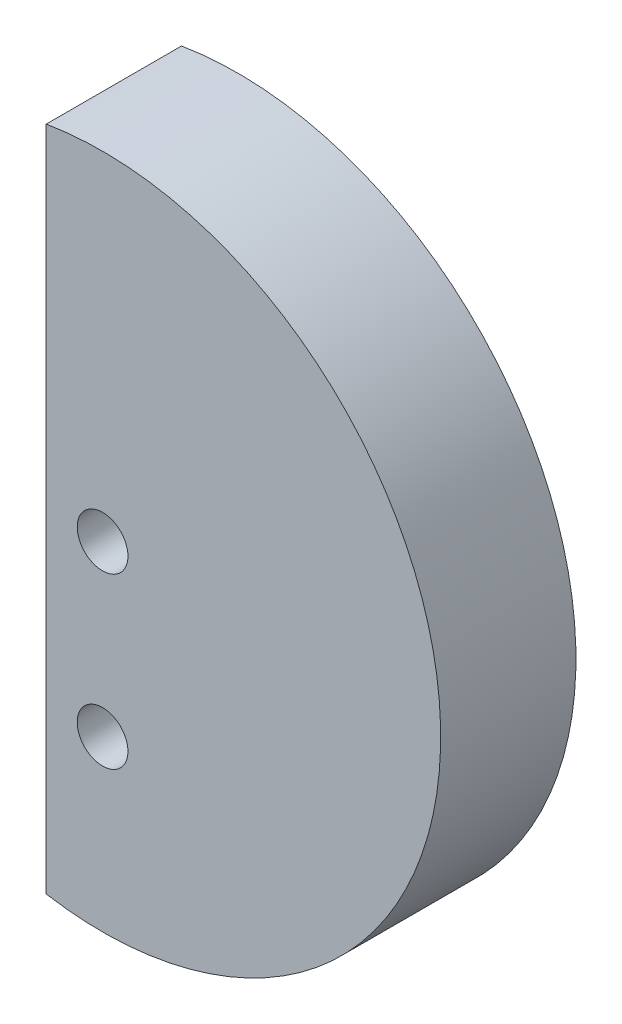
ISO-10303-21;
HEADER;
FILE_DESCRIPTION(('STEP AP214'),'2;1');
FILE_NAME('part.step','',(''),(''),'','','');
FILE_SCHEMA(('AUTOMOTIVE_DESIGN { 1 0 10303 214 1 1 1 1 }'));
ENDSEC;
DATA;
#1=APPLICATION_CONTEXT('core data for automotive mechanical design processes');
#2=APPLICATION_PROTOCOL_DEFINITION('international standard','automotive_design',2000,#1);
#3=PRODUCT_CONTEXT('',#1,'mechanical');
#4=PRODUCT('Part','Part','',(#3));
#5=PRODUCT_RELATED_PRODUCT_CATEGORY('part','',(#4));
#6=PRODUCT_DEFINITION_FORMATION('','',#4);
#7=PRODUCT_DEFINITION_CONTEXT('part definition',#1,'design');
#8=PRODUCT_DEFINITION('design','',#6,#7);
#9=PRODUCT_DEFINITION_SHAPE('','',#8);
#10=(LENGTH_UNIT() NAMED_UNIT(*) SI_UNIT(.MILLI.,.METRE.));
#11=(NAMED_UNIT(*) PLANE_ANGLE_UNIT() SI_UNIT($,.RADIAN.));
#12=(NAMED_UNIT(*) SI_UNIT($,.STERADIAN.) SOLID_ANGLE_UNIT());
#13=UNCERTAINTY_MEASURE_WITH_UNIT(LENGTH_MEASURE(1.E-05),#10,'distance_accuracy_value','');
#14=(GEOMETRIC_REPRESENTATION_CONTEXT(3) GLOBAL_UNCERTAINTY_ASSIGNED_CONTEXT((#13)) GLOBAL_UNIT_ASSIGNED_CONTEXT((#10,
#11,#12)) REPRESENTATION_CONTEXT('',''));
#15=CARTESIAN_POINT('',(0.,0.,0.));
#16=DIRECTION('',(0.,0.,1.));
#17=DIRECTION('',(1.,0.,0.));
#18=AXIS2_PLACEMENT_3D('',#15,#16,#17);
#19=CARTESIAN_POINT('',(0.,0.,12.));
#20=DIRECTION('',(0.,0.,1.));
#21=DIRECTION('',(1.,0.,0.));
#22=AXIS2_PLACEMENT_3D('',#19,#20,#21);
#23=PLANE('',#22);
#24=DIRECTION('',(0.,1.,0.));
#25=VECTOR('',#24,1.);
#26=CARTESIAN_POINT('',(-5.,30.,12.));
#27=LINE('',#26,#25);
#28=CARTESIAN_POINT('',(-5.,-29.5803989154981,12.));
#29=VERTEX_POINT('',#28);
#30=CARTESIAN_POINT('',(-5.,29.5803989154981,12.));
#31=VERTEX_POINT('',#30);
#32=EDGE_CURVE('E56',#29,#31,#27,.T.);
#33=ORIENTED_EDGE('',*,*,#32,.F.);
#34=CARTESIAN_POINT('',(0.,0.,12.));
#35=DIRECTION('',(0.,0.,1.));
#36=DIRECTION('',(1.,0.,0.));
#37=AXIS2_PLACEMENT_3D('',#34,#35,#36);
#38=CIRCLE('',#37,30.);
#39=EDGE_CURVE('E70',#29,#31,#38,.T.);
#40=ORIENTED_EDGE('',*,*,#39,.T.);
#41=EDGE_LOOP('',(#33,#40));
#42=FACE_BOUND('',#41,.T.);
#43=CARTESIAN_POINT('',(0.,0.,12.));
#44=DIRECTION('',(0.,0.,1.));
#45=DIRECTION('',(1.,0.,0.));
#46=AXIS2_PLACEMENT_3D('',#43,#44,#45);
#47=CIRCLE('',#46,2.25);
#48=CARTESIAN_POINT('',(2.25,0.,12.));
#49=VERTEX_POINT('',#48);
#50=EDGE_CURVE('E78',#49,#49,#47,.T.);
#51=ORIENTED_EDGE('',*,*,#50,.F.);
#52=EDGE_LOOP('',(#51));
#53=FACE_BOUND('',#52,.T.);
#54=CARTESIAN_POINT('',(0.,-15.,12.));
#55=DIRECTION('',(0.,0.,1.));
#56=DIRECTION('',(1.,0.,0.));
#57=AXIS2_PLACEMENT_3D('',#54,#55,#56);
#58=CIRCLE('',#57,2.25);
#59=CARTESIAN_POINT('',(2.25,-15.,12.));
#60=VERTEX_POINT('',#59);
#61=EDGE_CURVE('E86',#60,#60,#58,.T.);
#62=ORIENTED_EDGE('',*,*,#61,.F.);
#63=EDGE_LOOP('',(#62));
#64=FACE_BOUND('',#63,.T.);
#65=ADVANCED_FACE('F41',(#42,#53,#64),#23,.T.);
#66=CARTESIAN_POINT('',(0.,0.,0.));
#67=DIRECTION('',(0.,0.,1.));
#68=DIRECTION('',(1.,0.,0.));
#69=AXIS2_PLACEMENT_3D('',#66,#67,#68);
#70=PLANE('',#69);
#71=CARTESIAN_POINT('',(0.,0.,0.));
#72=DIRECTION('',(0.,0.,1.));
#73=DIRECTION('',(1.,0.,0.));
#74=AXIS2_PLACEMENT_3D('',#71,#72,#73);
#75=CIRCLE('',#74,30.);
#76=CARTESIAN_POINT('',(-5.,-29.5803989154981,0.));
#77=VERTEX_POINT('',#76);
#78=CARTESIAN_POINT('',(-5.,29.5803989154981,0.));
#79=VERTEX_POINT('',#78);
#80=EDGE_CURVE('E75',#77,#79,#75,.T.);
#81=ORIENTED_EDGE('',*,*,#80,.F.);
#82=DIRECTION('',(0.,-1.,0.));
#83=VECTOR('',#82,1.);
#84=CARTESIAN_POINT('',(-5.,30.,0.));
#85=LINE('',#84,#83);
#86=EDGE_CURVE('E65',#79,#77,#85,.T.);
#87=ORIENTED_EDGE('',*,*,#86,.F.);
#88=EDGE_LOOP('',(#81,#87));
#89=FACE_BOUND('',#88,.T.);
#90=CARTESIAN_POINT('',(0.,0.,0.));
#91=DIRECTION('',(0.,0.,1.));
#92=DIRECTION('',(1.,0.,0.));
#93=AXIS2_PLACEMENT_3D('',#90,#91,#92);
#94=CIRCLE('',#93,2.25);
#95=CARTESIAN_POINT('',(2.25,0.,0.));
#96=VERTEX_POINT('',#95);
#97=EDGE_CURVE('E82',#96,#96,#94,.T.);
#98=ORIENTED_EDGE('',*,*,#97,.T.);
#99=EDGE_LOOP('',(#98));
#100=FACE_BOUND('',#99,.T.);
#101=CARTESIAN_POINT('',(0.,-15.,0.));
#102=DIRECTION('',(0.,0.,1.));
#103=DIRECTION('',(1.,0.,0.));
#104=AXIS2_PLACEMENT_3D('',#101,#102,#103);
#105=CIRCLE('',#104,2.25);
#106=CARTESIAN_POINT('',(2.25,-15.,0.));
#107=VERTEX_POINT('',#106);
#108=EDGE_CURVE('E76',#107,#107,#105,.T.);
#109=ORIENTED_EDGE('',*,*,#108,.T.);
#110=EDGE_LOOP('',(#109));
#111=FACE_BOUND('',#110,.T.);
#112=ADVANCED_FACE('F73',(#89,#100,#111),#70,.F.);
#113=CARTESIAN_POINT('',(0.,0.,12.));
#114=DIRECTION('',(0.,0.,-1.));
#115=DIRECTION('',(-1.,0.,0.));
#116=AXIS2_PLACEMENT_3D('',#113,#114,#115);
#117=CYLINDRICAL_SURFACE('',#116,30.);
#118=ORIENTED_EDGE('',*,*,#39,.F.);
#119=DIRECTION('',(0.,0.,-1.));
#120=VECTOR('',#119,1.);
#121=CARTESIAN_POINT('',(-5.,-29.5803989154981,12.));
#122=LINE('',#121,#120);
#123=EDGE_CURVE('E11',#29,#77,#122,.T.);
#124=ORIENTED_EDGE('',*,*,#123,.T.);
#125=ORIENTED_EDGE('',*,*,#80,.T.);
#126=DIRECTION('',(0.,0.,-1.));
#127=VECTOR('',#126,1.);
#128=CARTESIAN_POINT('',(-5.,29.5803989154981,12.));
#129=LINE('',#128,#127);
#130=EDGE_CURVE('E49',#79,#31,#129,.F.);
#131=ORIENTED_EDGE('',*,*,#130,.T.);
#132=EDGE_LOOP('',(#118,#124,#125,#131));
#133=FACE_BOUND('',#132,.T.);
#134=ADVANCED_FACE('F43',(#133),#117,.T.);
#135=CARTESIAN_POINT('',(0.,0.,12.));
#136=DIRECTION('',(0.,0.,-1.));
#137=DIRECTION('',(-1.,0.,0.));
#138=AXIS2_PLACEMENT_3D('',#135,#136,#137);
#139=CYLINDRICAL_SURFACE('',#138,2.25);
#140=ORIENTED_EDGE('',*,*,#50,.T.);
#141=EDGE_LOOP('',(#140));
#142=FACE_BOUND('',#141,.T.);
#143=ORIENTED_EDGE('',*,*,#97,.F.);
#144=EDGE_LOOP('',(#143));
#145=FACE_BOUND('',#144,.T.);
#146=ADVANCED_FACE('F106',(#142,#145),#139,.F.);
#147=CARTESIAN_POINT('',(0.,-15.,12.));
#148=DIRECTION('',(0.,0.,-1.));
#149=DIRECTION('',(-1.,0.,0.));
#150=AXIS2_PLACEMENT_3D('',#147,#148,#149);
#151=CYLINDRICAL_SURFACE('',#150,2.25);
#152=ORIENTED_EDGE('',*,*,#61,.T.);
#153=EDGE_LOOP('',(#152));
#154=FACE_BOUND('',#153,.T.);
#155=ORIENTED_EDGE('',*,*,#108,.F.);
#156=EDGE_LOOP('',(#155));
#157=FACE_BOUND('',#156,.T.);
#158=ADVANCED_FACE('F94',(#154,#157),#151,.F.);
#159=CARTESIAN_POINT('',(-5.,30.,-67.0820393249937));
#160=DIRECTION('',(1.,0.,0.));
#161=DIRECTION('',(0.,1.,0.));
#162=AXIS2_PLACEMENT_3D('',#159,#160,#161);
#163=PLANE('',#162);
#164=ORIENTED_EDGE('',*,*,#32,.T.);
#165=ORIENTED_EDGE('',*,*,#130,.F.);
#166=ORIENTED_EDGE('',*,*,#86,.T.);
#167=ORIENTED_EDGE('',*,*,#123,.F.);
#168=EDGE_LOOP('',(#164,#165,#166,#167));
#169=FACE_BOUND('',#168,.T.);
#170=ADVANCED_FACE('F64',(#169),#163,.F.);
#171=CLOSED_SHELL('',(#65,#112,#134,#146,#158,#170));
#172=MANIFOLD_SOLID_BREP('B2',#171);
#173=ADVANCED_BREP_SHAPE_REPRESENTATION('',(#18,#172),#14);
#174=SHAPE_DEFINITION_REPRESENTATION(#9,#173);
ENDSEC;
END-ISO-10303-21;
